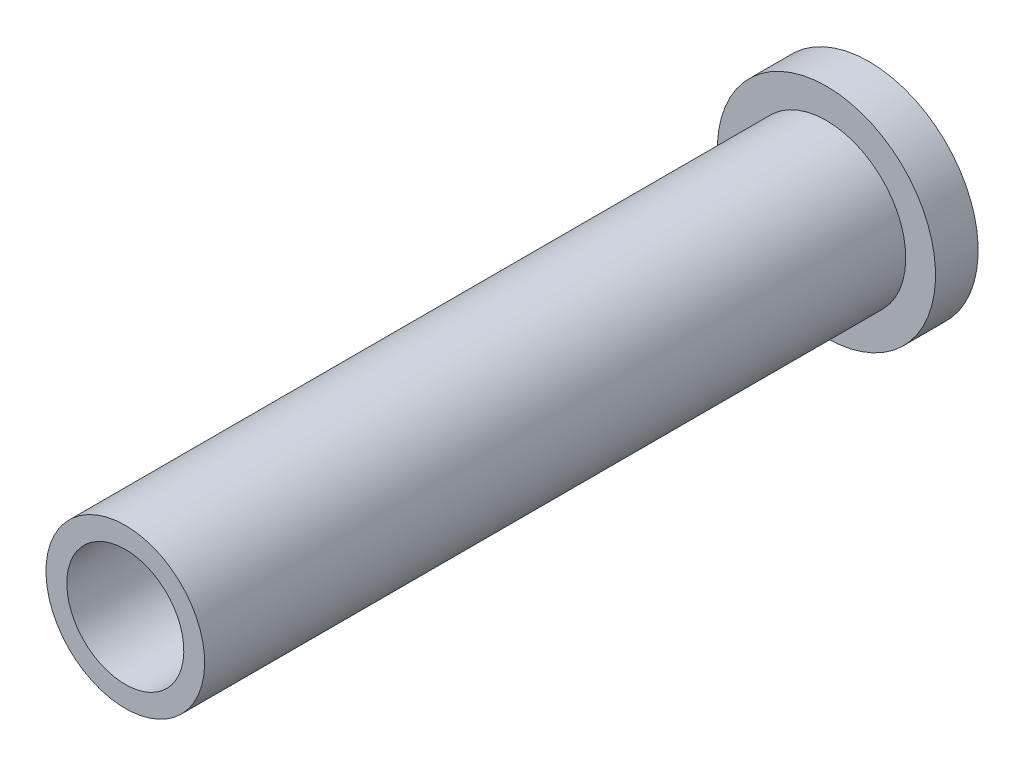
ISO-10303-21;
HEADER;
FILE_DESCRIPTION(('STEP AP214'),'2;1');
FILE_NAME('part.step','',(''),(''),'','','');
FILE_SCHEMA(('AUTOMOTIVE_DESIGN { 1 0 10303 214 1 1 1 1 }'));
ENDSEC;
DATA;
#1=APPLICATION_CONTEXT('core data for automotive mechanical design processes');
#2=APPLICATION_PROTOCOL_DEFINITION('international standard','automotive_design',2000,#1);
#3=PRODUCT_CONTEXT('',#1,'mechanical');
#4=PRODUCT('Part','Part','',(#3));
#5=PRODUCT_RELATED_PRODUCT_CATEGORY('part','',(#4));
#6=PRODUCT_DEFINITION_FORMATION('','',#4);
#7=PRODUCT_DEFINITION_CONTEXT('part definition',#1,'design');
#8=PRODUCT_DEFINITION('design','',#6,#7);
#9=PRODUCT_DEFINITION_SHAPE('','',#8);
#10=(LENGTH_UNIT() NAMED_UNIT(*) SI_UNIT(.MILLI.,.METRE.));
#11=(NAMED_UNIT(*) PLANE_ANGLE_UNIT() SI_UNIT($,.RADIAN.));
#12=(NAMED_UNIT(*) SI_UNIT($,.STERADIAN.) SOLID_ANGLE_UNIT());
#13=UNCERTAINTY_MEASURE_WITH_UNIT(LENGTH_MEASURE(1.E-05),#10,'distance_accuracy_value','');
#14=(GEOMETRIC_REPRESENTATION_CONTEXT(3) GLOBAL_UNCERTAINTY_ASSIGNED_CONTEXT((#13)) GLOBAL_UNIT_ASSIGNED_CONTEXT((#10,
#11,#12)) REPRESENTATION_CONTEXT('',''));
#15=CARTESIAN_POINT('',(0.,0.,0.));
#16=DIRECTION('',(0.,0.,1.));
#17=DIRECTION('',(1.,0.,0.));
#18=AXIS2_PLACEMENT_3D('',#15,#16,#17);
#19=CARTESIAN_POINT('',(7.35068319111971E-10,3.66900985487254E-10,6002260.));
#20=DIRECTION('',(0.,0.,-1.));
#21=DIRECTION('',(0.,1.,0.));
#22=AXIS2_PLACEMENT_3D('',#19,#20,#21);
#23=CYLINDRICAL_SURFACE('',#22,59.);
#24=CARTESIAN_POINT('',(1.8839111362323E-13,-5.38978511919919E-13,1510.00000000022));
#25=DIRECTION('',(0.,0.,-1.));
#26=DIRECTION('',(0.,1.,0.));
#27=AXIS2_PLACEMENT_3D('',#24,#25,#26);
#28=CIRCLE('',#27,59.);
#29=CARTESIAN_POINT('',(1.99229237795685E-13,58.9999999999995,1510.00000000022));
#30=VERTEX_POINT('',#29);
#31=EDGE_CURVE('E37',#30,#30,#28,.F.);
#32=ORIENTED_EDGE('',*,*,#31,.F.);
#33=EDGE_LOOP('',(#32));
#34=FACE_BOUND('',#33,.T.);
#35=CARTESIAN_POINT('',(2.80239623559282E-13,-4.93054256951894E-13,2260.00000000022));
#36=DIRECTION('',(0.,0.,-1.));
#37=DIRECTION('',(0.,1.,0.));
#38=AXIS2_PLACEMENT_3D('',#35,#36,#37);
#39=CIRCLE('',#38,59.);
#40=CARTESIAN_POINT('',(2.91077747731736E-13,58.9999999999995,2260.00000000022));
#41=VERTEX_POINT('',#40);
#42=EDGE_CURVE('E47',#41,#41,#39,.F.);
#43=ORIENTED_EDGE('',*,*,#42,.T.);
#44=EDGE_LOOP('',(#43));
#45=FACE_BOUND('',#44,.T.);
#46=ADVANCED_FACE('F16',(#34,#45),#23,.F.);
#47=CARTESIAN_POINT('',(7.35068319111971E-10,3.66907924381158E-10,6002260.));
#48=DIRECTION('',(0.,0.,-1.));
#49=DIRECTION('',(0.,1.,0.));
#50=AXIS2_PLACEMENT_3D('',#47,#48,#49);
#51=CYLINDRICAL_SURFACE('',#50,80.);
#52=CARTESIAN_POINT('',(1.93657094859523E-13,-5.29406627397866E-13,1552.99999999989));
#53=DIRECTION('',(0.,0.,-1.));
#54=DIRECTION('',(0.,1.,0.));
#55=AXIS2_PLACEMENT_3D('',#52,#53,#54);
#56=CIRCLE('',#55,80.);
#57=CARTESIAN_POINT('',(2.08352856449291E-13,79.9999999999995,1552.99999999989));
#58=VERTEX_POINT('',#57);
#59=EDGE_CURVE('E31',#58,#58,#56,.F.);
#60=ORIENTED_EDGE('',*,*,#59,.T.);
#61=EDGE_LOOP('',(#60));
#62=FACE_BOUND('',#61,.T.);
#63=CARTESIAN_POINT('',(2.80239623559282E-13,-4.86115363047986E-13,2260.00000000022));
#64=DIRECTION('',(0.,0.,-1.));
#65=DIRECTION('',(0.,1.,0.));
#66=AXIS2_PLACEMENT_3D('',#63,#64,#65);
#67=CIRCLE('',#66,80.);
#68=CARTESIAN_POINT('',(2.9493538514905E-13,79.9999999999995,2260.00000000022));
#69=VERTEX_POINT('',#68);
#70=EDGE_CURVE('E43',#69,#69,#67,.F.);
#71=ORIENTED_EDGE('',*,*,#70,.F.);
#72=EDGE_LOOP('',(#71));
#73=FACE_BOUND('',#72,.T.);
#74=ADVANCED_FACE('F61',(#62,#73),#51,.T.);
#75=CARTESIAN_POINT('',(1.84919646004032E-13,-0.0109999999999047,1510.));
#76=DIRECTION('',(0.,0.,-1.));
#77=DIRECTION('',(0.,1.,0.));
#78=AXIS2_PLACEMENT_3D('',#75,#76,#77);
#79=PLANE('',#78);
#80=ORIENTED_EDGE('',*,*,#31,.T.);
#81=EDGE_LOOP('',(#80));
#82=FACE_BOUND('',#81,.T.);
#83=CARTESIAN_POINT('',(1.91860560575184E-13,-5.32039618016012E-13,1510.00000000022));
#84=DIRECTION('',(0.,0.,-1.));
#85=DIRECTION('',(0.,1.,0.));
#86=AXIS2_PLACEMENT_3D('',#83,#84,#85);
#87=CIRCLE('',#86,110.);
#88=CARTESIAN_POINT('',(2.12067232761115E-13,109.999999999999,1510.00000000022));
#89=VERTEX_POINT('',#88);
#90=EDGE_CURVE('E24',#89,#89,#87,.T.);
#91=ORIENTED_EDGE('',*,*,#90,.T.);
#92=EDGE_LOOP('',(#91));
#93=FACE_BOUND('',#92,.T.);
#94=ADVANCED_FACE('F58',(#82,#93),#79,.T.);
#95=CARTESIAN_POINT('',(1.90185627240365E-13,-0.010999999999902,1553.));
#96=DIRECTION('',(0.,0.,-1.));
#97=DIRECTION('',(0.,1.,0.));
#98=AXIS2_PLACEMENT_3D('',#95,#96,#97);
#99=PLANE('',#98);
#100=ORIENTED_EDGE('',*,*,#59,.F.);
#101=EDGE_LOOP('',(#100));
#102=FACE_BOUND('',#101,.T.);
#103=CARTESIAN_POINT('',(1.97126541811477E-13,-5.29406627397866E-13,1552.99999999989));
#104=DIRECTION('',(0.,0.,-1.));
#105=DIRECTION('',(0.,1.,0.));
#106=AXIS2_PLACEMENT_3D('',#103,#104,#105);
#107=CIRCLE('',#106,110.);
#108=CARTESIAN_POINT('',(2.17333213997408E-13,109.999999999999,1552.99999999989));
#109=VERTEX_POINT('',#108);
#110=EDGE_CURVE('E10',#109,#109,#107,.F.);
#111=ORIENTED_EDGE('',*,*,#110,.T.);
#112=EDGE_LOOP('',(#111));
#113=FACE_BOUND('',#112,.T.);
#114=ADVANCED_FACE('F70',(#102,#113),#99,.F.);
#115=CARTESIAN_POINT('',(7.34985206030224E-10,3.66864633116808E-10,6001553.));
#116=DIRECTION('',(0.,0.,-1.));
#117=DIRECTION('',(0.,1.,0.));
#118=AXIS2_PLACEMENT_3D('',#115,#116,#117);
#119=CYLINDRICAL_SURFACE('',#118,110.);
#120=ORIENTED_EDGE('',*,*,#90,.F.);
#121=EDGE_LOOP('',(#120));
#122=FACE_BOUND('',#121,.T.);
#123=ORIENTED_EDGE('',*,*,#110,.F.);
#124=EDGE_LOOP('',(#123));
#125=FACE_BOUND('',#124,.T.);
#126=ADVANCED_FACE('F18',(#122,#125),#119,.T.);
#127=CARTESIAN_POINT('',(2.76768707031143E-13,-0.00799999999987656,2260.));
#128=DIRECTION('',(0.,0.,-1.));
#129=DIRECTION('',(0.,1.,0.));
#130=AXIS2_PLACEMENT_3D('',#127,#128,#129);
#131=PLANE('',#130);
#132=ORIENTED_EDGE('',*,*,#42,.F.);
#133=EDGE_LOOP('',(#132));
#134=FACE_BOUND('',#133,.T.);
#135=ORIENTED_EDGE('',*,*,#70,.T.);
#136=EDGE_LOOP('',(#135));
#137=FACE_BOUND('',#136,.T.);
#138=ADVANCED_FACE('F54',(#134,#137),#131,.F.);
#139=CLOSED_SHELL('',(#46,#74,#94,#114,#126,#138));
#140=MANIFOLD_SOLID_BREP('B1',#139);
#141=ADVANCED_BREP_SHAPE_REPRESENTATION('',(#18,#140),#14);
#142=SHAPE_DEFINITION_REPRESENTATION(#9,#141);
ENDSEC;
END-ISO-10303-21;
